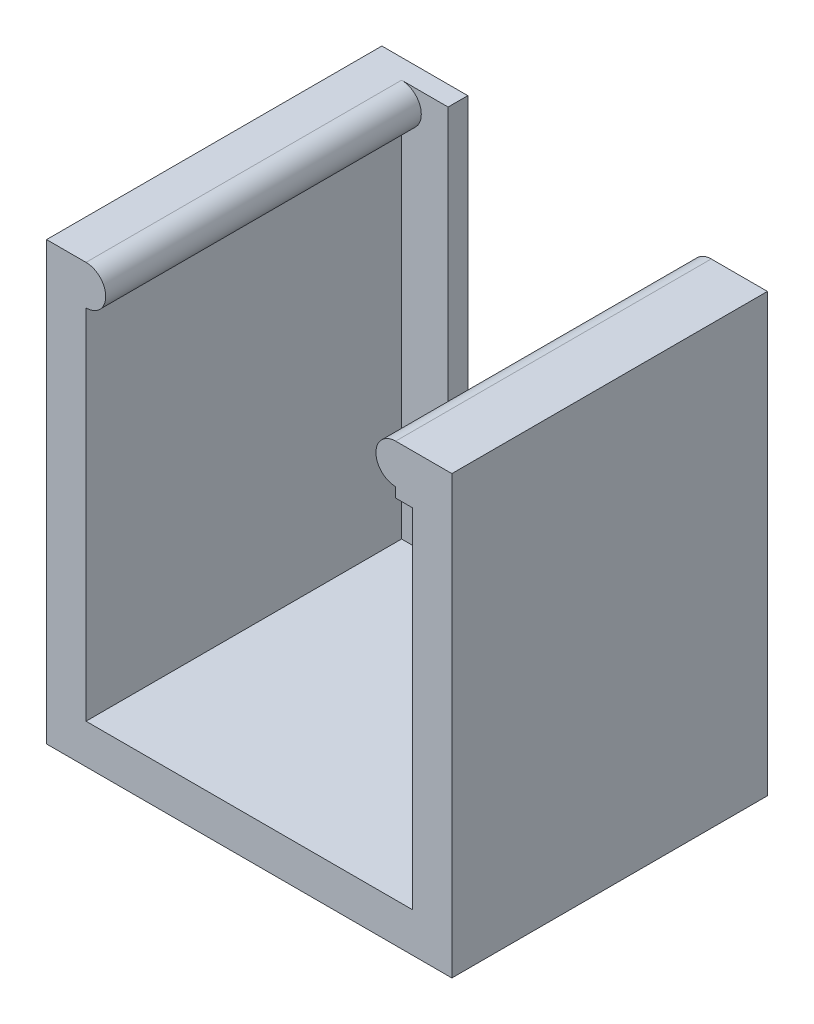
ISO-10303-21;
HEADER;
FILE_DESCRIPTION(('STEP AP214'),'2;1');
FILE_NAME('part.step','',(''),(''),'','','');
FILE_SCHEMA(('AUTOMOTIVE_DESIGN { 1 0 10303 214 1 1 1 1 }'));
ENDSEC;
DATA;
#1=APPLICATION_CONTEXT('core data for automotive mechanical design processes');
#2=APPLICATION_PROTOCOL_DEFINITION('international standard','automotive_design',2000,#1);
#3=PRODUCT_CONTEXT('',#1,'mechanical');
#4=PRODUCT('Part','Part','',(#3));
#5=PRODUCT_RELATED_PRODUCT_CATEGORY('part','',(#4));
#6=PRODUCT_DEFINITION_FORMATION('','',#4);
#7=PRODUCT_DEFINITION_CONTEXT('part definition',#1,'design');
#8=PRODUCT_DEFINITION('design','',#6,#7);
#9=PRODUCT_DEFINITION_SHAPE('','',#8);
#10=(LENGTH_UNIT() NAMED_UNIT(*) SI_UNIT(.MILLI.,.METRE.));
#11=(NAMED_UNIT(*) PLANE_ANGLE_UNIT() SI_UNIT($,.RADIAN.));
#12=(NAMED_UNIT(*) SI_UNIT($,.STERADIAN.) SOLID_ANGLE_UNIT());
#13=UNCERTAINTY_MEASURE_WITH_UNIT(LENGTH_MEASURE(1.E-05),#10,'distance_accuracy_value','');
#14=(GEOMETRIC_REPRESENTATION_CONTEXT(3) GLOBAL_UNCERTAINTY_ASSIGNED_CONTEXT((#13)) GLOBAL_UNIT_ASSIGNED_CONTEXT((#10,
#11,#12)) REPRESENTATION_CONTEXT('',''));
#15=CARTESIAN_POINT('',(0.,0.,0.));
#16=DIRECTION('',(0.,0.,1.));
#17=DIRECTION('',(1.,0.,0.));
#18=AXIS2_PLACEMENT_3D('',#15,#16,#17);
#19=CARTESIAN_POINT('',(7.85,1.,16.));
#20=DIRECTION('',(1.,0.,0.));
#21=DIRECTION('',(0.,0.,-1.));
#22=AXIS2_PLACEMENT_3D('',#19,#20,#21);
#23=PLANE('',#22);
#24=DIRECTION('',(0.,0.,-1.));
#25=VECTOR('',#24,1.);
#26=CARTESIAN_POINT('',(7.85,-0.999999999999997,16.));
#27=LINE('',#26,#25);
#28=CARTESIAN_POINT('',(7.85,-0.999999999999997,0.));
#29=VERTEX_POINT('',#28);
#30=CARTESIAN_POINT('',(7.85,-0.999999999999997,16.));
#31=VERTEX_POINT('',#30);
#32=EDGE_CURVE('E184',#29,#31,#27,.F.);
#33=ORIENTED_EDGE('',*,*,#32,.F.);
#34=DIRECTION('',(0.,-1.,0.));
#35=VECTOR('',#34,1.);
#36=CARTESIAN_POINT('',(7.85,1.,0.));
#37=LINE('',#36,#35);
#38=CARTESIAN_POINT('',(7.85,-1.5,0.));
#39=VERTEX_POINT('',#38);
#40=EDGE_CURVE('E188',#29,#39,#37,.T.);
#41=ORIENTED_EDGE('',*,*,#40,.T.);
#42=DIRECTION('',(0.,0.,-1.));
#43=VECTOR('',#42,1.);
#44=CARTESIAN_POINT('',(7.85,-1.5,16.));
#45=LINE('',#44,#43);
#46=CARTESIAN_POINT('',(7.85,-1.5,16.));
#47=VERTEX_POINT('',#46);
#48=EDGE_CURVE('E253',#47,#39,#45,.T.);
#49=ORIENTED_EDGE('',*,*,#48,.F.);
#50=DIRECTION('',(0.,-1.,0.));
#51=VECTOR('',#50,1.);
#52=CARTESIAN_POINT('',(7.85,1.,16.));
#53=LINE('',#52,#51);
#54=EDGE_CURVE('E189',#31,#47,#53,.T.);
#55=ORIENTED_EDGE('',*,*,#54,.F.);
#56=EDGE_LOOP('',(#33,#41,#49,#55));
#57=FACE_BOUND('',#56,.T.);
#58=ADVANCED_FACE('F35',(#57),#23,.F.);
#59=CARTESIAN_POINT('',(-7.85,0.,16.));
#60=DIRECTION('',(0.,0.,-1.));
#61=DIRECTION('',(-1.,0.,0.));
#62=AXIS2_PLACEMENT_3D('',#59,#60,#61);
#63=CYLINDRICAL_SURFACE('',#62,1.);
#64=DIRECTION('',(0.,0.,-1.));
#65=VECTOR('',#64,1.);
#66=CARTESIAN_POINT('',(-7.85,-1.,16.));
#67=LINE('',#66,#65);
#68=CARTESIAN_POINT('',(-7.85,-1.,0.));
#69=VERTEX_POINT('',#68);
#70=CARTESIAN_POINT('',(-7.85,-1.,16.));
#71=VERTEX_POINT('',#70);
#72=EDGE_CURVE('E256',#69,#71,#67,.F.);
#73=ORIENTED_EDGE('',*,*,#72,.F.);
#74=CARTESIAN_POINT('',(-7.85,0.,0.));
#75=DIRECTION('',(0.,0.,1.));
#76=DIRECTION('',(1.,0.,0.));
#77=AXIS2_PLACEMENT_3D('',#74,#75,#76);
#78=CIRCLE('',#77,1.);
#79=CARTESIAN_POINT('',(-7.85,1.,0.));
#80=VERTEX_POINT('',#79);
#81=EDGE_CURVE('E39',#69,#80,#78,.T.);
#82=ORIENTED_EDGE('',*,*,#81,.T.);
#83=DIRECTION('',(0.,0.,-1.));
#84=VECTOR('',#83,1.);
#85=CARTESIAN_POINT('',(-7.85,1.,16.));
#86=LINE('',#85,#84);
#87=CARTESIAN_POINT('',(-7.85,1.,16.));
#88=VERTEX_POINT('',#87);
#89=EDGE_CURVE('E242',#88,#80,#86,.T.);
#90=ORIENTED_EDGE('',*,*,#89,.F.);
#91=CARTESIAN_POINT('',(-7.85,0.,16.));
#92=DIRECTION('',(0.,0.,1.));
#93=DIRECTION('',(1.,0.,0.));
#94=AXIS2_PLACEMENT_3D('',#91,#92,#93);
#95=CIRCLE('',#94,1.);
#96=EDGE_CURVE('E44',#71,#88,#95,.T.);
#97=ORIENTED_EDGE('',*,*,#96,.F.);
#98=EDGE_LOOP('',(#73,#82,#90,#97));
#99=FACE_BOUND('',#98,.T.);
#100=ADVANCED_FACE('F37',(#99),#63,.T.);
#101=CARTESIAN_POINT('',(-7.85,0.,16.));
#102=DIRECTION('',(0.,0.,1.));
#103=DIRECTION('',(1.,0.,0.));
#104=AXIS2_PLACEMENT_3D('',#101,#102,#103);
#105=PLANE('',#104);
#106=DIRECTION('',(-1.,0.,0.));
#107=VECTOR('',#106,1.);
#108=CARTESIAN_POINT('',(7.85,1.,16.));
#109=LINE('',#108,#107);
#110=CARTESIAN_POINT('',(10.7,1.,16.));
#111=VERTEX_POINT('',#110);
#112=CARTESIAN_POINT('',(7.85,1.,16.));
#113=VERTEX_POINT('',#112);
#114=EDGE_CURVE('E209',#111,#113,#109,.T.);
#115=ORIENTED_EDGE('',*,*,#114,.T.);
#116=CARTESIAN_POINT('',(7.85,0.,16.));
#117=DIRECTION('',(0.,0.,1.));
#118=DIRECTION('',(1.,0.,0.));
#119=AXIS2_PLACEMENT_3D('',#116,#117,#118);
#120=CIRCLE('',#119,1.);
#121=EDGE_CURVE('E177',#113,#31,#120,.T.);
#122=ORIENTED_EDGE('',*,*,#121,.T.);
#123=ORIENTED_EDGE('',*,*,#54,.T.);
#124=DIRECTION('',(1.,0.,0.));
#125=VECTOR('',#124,1.);
#126=CARTESIAN_POINT('',(7.85,-1.5,16.));
#127=LINE('',#126,#125);
#128=CARTESIAN_POINT('',(8.7,-1.5,16.));
#129=VERTEX_POINT('',#128);
#130=EDGE_CURVE('E191',#47,#129,#127,.T.);
#131=ORIENTED_EDGE('',*,*,#130,.T.);
#132=DIRECTION('',(0.,-1.,0.));
#133=VECTOR('',#132,1.);
#134=CARTESIAN_POINT('',(8.7,-1.5,16.));
#135=LINE('',#134,#133);
#136=CARTESIAN_POINT('',(8.7,-19.1487700378055,16.));
#137=VERTEX_POINT('',#136);
#138=EDGE_CURVE('E194',#129,#137,#135,.T.);
#139=ORIENTED_EDGE('',*,*,#138,.T.);
#140=DIRECTION('',(-1.,0.,0.));
#141=VECTOR('',#140,1.);
#142=CARTESIAN_POINT('',(-7.85,-19.1487700378055,16.));
#143=LINE('',#142,#141);
#144=CARTESIAN_POINT('',(-7.85,-19.1487700378055,16.));
#145=VERTEX_POINT('',#144);
#146=EDGE_CURVE('E196',#137,#145,#143,.T.);
#147=ORIENTED_EDGE('',*,*,#146,.T.);
#148=DIRECTION('',(0.,1.,0.));
#149=VECTOR('',#148,1.);
#150=CARTESIAN_POINT('',(-7.85,1.,16.));
#151=LINE('',#150,#149);
#152=EDGE_CURVE('E198',#145,#71,#151,.T.);
#153=ORIENTED_EDGE('',*,*,#152,.T.);
#154=ORIENTED_EDGE('',*,*,#96,.T.);
#155=DIRECTION('',(-1.,0.,0.));
#156=VECTOR('',#155,1.);
#157=CARTESIAN_POINT('',(-7.85,1.,16.));
#158=LINE('',#157,#156);
#159=CARTESIAN_POINT('',(-9.85,1.,16.));
#160=VERTEX_POINT('',#159);
#161=EDGE_CURVE('E201',#88,#160,#158,.T.);
#162=ORIENTED_EDGE('',*,*,#161,.T.);
#163=DIRECTION('',(0.,-1.,0.));
#164=VECTOR('',#163,1.);
#165=CARTESIAN_POINT('',(-9.85,1.,16.));
#166=LINE('',#165,#164);
#167=CARTESIAN_POINT('',(-9.85,-21.1487700378055,16.));
#168=VERTEX_POINT('',#167);
#169=EDGE_CURVE('E203',#160,#168,#166,.T.);
#170=ORIENTED_EDGE('',*,*,#169,.T.);
#171=DIRECTION('',(1.,0.,0.));
#172=VECTOR('',#171,1.);
#173=CARTESIAN_POINT('',(10.7,-21.1487700378055,16.));
#174=LINE('',#173,#172);
#175=CARTESIAN_POINT('',(10.7,-21.1487700378055,16.));
#176=VERTEX_POINT('',#175);
#177=EDGE_CURVE('E205',#168,#176,#174,.T.);
#178=ORIENTED_EDGE('',*,*,#177,.T.);
#179=DIRECTION('',(0.,1.,0.));
#180=VECTOR('',#179,1.);
#181=CARTESIAN_POINT('',(10.7,1.,16.));
#182=LINE('',#181,#180);
#183=EDGE_CURVE('E207',#176,#111,#182,.T.);
#184=ORIENTED_EDGE('',*,*,#183,.T.);
#185=EDGE_LOOP('',(#115,#122,#123,#131,#139,#147,#153,#154,#162,#170,#178,#184));
#186=FACE_BOUND('',#185,.T.);
#187=ADVANCED_FACE('F278',(#186),#105,.T.);
#188=CARTESIAN_POINT('',(-7.85,0.,0.));
#189=DIRECTION('',(0.,0.,1.));
#190=DIRECTION('',(1.,0.,0.));
#191=AXIS2_PLACEMENT_3D('',#188,#189,#190);
#192=PLANE('',#191);
#193=DIRECTION('',(0.,-1.,0.));
#194=VECTOR('',#193,1.);
#195=CARTESIAN_POINT('',(-9.85,1.,0.));
#196=LINE('',#195,#194);
#197=CARTESIAN_POINT('',(-9.85,-20.3611134108428,0.));
#198=VERTEX_POINT('',#197);
#199=CARTESIAN_POINT('',(-9.85,-21.1487700378055,0.));
#200=VERTEX_POINT('',#199);
#201=EDGE_CURVE('E57',#198,#200,#196,.T.);
#202=ORIENTED_EDGE('',*,*,#201,.F.);
#203=DIRECTION('',(1.,0.,0.));
#204=VECTOR('',#203,1.);
#205=CARTESIAN_POINT('',(-9.85,-20.3611134108428,0.));
#206=LINE('',#205,#204);
#207=CARTESIAN_POINT('',(-5.49189320099877,-20.3611134108428,0.));
#208=VERTEX_POINT('',#207);
#209=EDGE_CURVE('E167',#198,#208,#206,.T.);
#210=ORIENTED_EDGE('',*,*,#209,.T.);
#211=DIRECTION('',(0.,-1.,0.));
#212=VECTOR('',#211,1.);
#213=CARTESIAN_POINT('',(-5.49189320099877,1.,0.));
#214=LINE('',#213,#212);
#215=CARTESIAN_POINT('',(-5.49189320099877,-19.1487700378055,0.));
#216=VERTEX_POINT('',#215);
#217=EDGE_CURVE('E11',#216,#208,#214,.T.);
#218=ORIENTED_EDGE('',*,*,#217,.F.);
#219=DIRECTION('',(-1.,0.,0.));
#220=VECTOR('',#219,1.);
#221=CARTESIAN_POINT('',(-7.85,-19.1487700378055,0.));
#222=LINE('',#221,#220);
#223=CARTESIAN_POINT('',(8.7,-19.1487700378055,0.));
#224=VERTEX_POINT('',#223);
#225=EDGE_CURVE('E218',#224,#216,#222,.T.);
#226=ORIENTED_EDGE('',*,*,#225,.F.);
#227=DIRECTION('',(0.,-1.,0.));
#228=VECTOR('',#227,1.);
#229=CARTESIAN_POINT('',(8.7,-1.5,0.));
#230=LINE('',#229,#228);
#231=CARTESIAN_POINT('',(8.7,-1.5,0.));
#232=VERTEX_POINT('',#231);
#233=EDGE_CURVE('E215',#232,#224,#230,.T.);
#234=ORIENTED_EDGE('',*,*,#233,.F.);
#235=DIRECTION('',(1.,0.,0.));
#236=VECTOR('',#235,1.);
#237=CARTESIAN_POINT('',(7.85,-1.5,0.));
#238=LINE('',#237,#236);
#239=EDGE_CURVE('E213',#39,#232,#238,.T.);
#240=ORIENTED_EDGE('',*,*,#239,.F.);
#241=ORIENTED_EDGE('',*,*,#40,.F.);
#242=CARTESIAN_POINT('',(7.85,0.,0.));
#243=DIRECTION('',(0.,0.,1.));
#244=DIRECTION('',(1.,0.,0.));
#245=AXIS2_PLACEMENT_3D('',#242,#243,#244);
#246=CIRCLE('',#245,1.);
#247=CARTESIAN_POINT('',(7.85,1.,0.));
#248=VERTEX_POINT('',#247);
#249=EDGE_CURVE('E174',#248,#29,#246,.T.);
#250=ORIENTED_EDGE('',*,*,#249,.F.);
#251=DIRECTION('',(-1.,0.,0.));
#252=VECTOR('',#251,1.);
#253=CARTESIAN_POINT('',(7.85,1.,0.));
#254=LINE('',#253,#252);
#255=CARTESIAN_POINT('',(10.7,1.,0.));
#256=VERTEX_POINT('',#255);
#257=EDGE_CURVE('E192',#256,#248,#254,.T.);
#258=ORIENTED_EDGE('',*,*,#257,.F.);
#259=DIRECTION('',(0.,1.,0.));
#260=VECTOR('',#259,1.);
#261=CARTESIAN_POINT('',(10.7,1.,0.));
#262=LINE('',#261,#260);
#263=CARTESIAN_POINT('',(10.7,-21.1487700378055,0.));
#264=VERTEX_POINT('',#263);
#265=EDGE_CURVE('E226',#264,#256,#262,.T.);
#266=ORIENTED_EDGE('',*,*,#265,.F.);
#267=DIRECTION('',(1.,0.,0.));
#268=VECTOR('',#267,1.);
#269=CARTESIAN_POINT('',(10.7,-21.1487700378055,0.));
#270=LINE('',#269,#268);
#271=EDGE_CURVE('E224',#200,#264,#270,.T.);
#272=ORIENTED_EDGE('',*,*,#271,.F.);
#273=EDGE_LOOP('',(#202,#210,#218,#226,#234,#240,#241,#250,#258,#266,#272));
#274=FACE_BOUND('',#273,.T.);
#275=ADVANCED_FACE('F275',(#274),#192,.F.);
#276=CARTESIAN_POINT('',(-7.85,1.,16.));
#277=DIRECTION('',(-1.,0.,0.));
#278=DIRECTION('',(0.,-1.,0.));
#279=AXIS2_PLACEMENT_3D('',#276,#277,#278);
#280=PLANE('',#279);
#281=DIRECTION('',(0.,1.,0.));
#282=VECTOR('',#281,1.);
#283=CARTESIAN_POINT('',(-7.85,1.,0.));
#284=LINE('',#283,#282);
#285=CARTESIAN_POINT('',(-7.85,-19.1487700378055,0.));
#286=VERTEX_POINT('',#285);
#287=EDGE_CURVE('E220',#286,#69,#284,.T.);
#288=ORIENTED_EDGE('',*,*,#287,.T.);
#289=ORIENTED_EDGE('',*,*,#72,.T.);
#290=ORIENTED_EDGE('',*,*,#152,.F.);
#291=DIRECTION('',(0.,0.,-1.));
#292=VECTOR('',#291,1.);
#293=CARTESIAN_POINT('',(-7.85,-19.1487700378055,16.));
#294=LINE('',#293,#292);
#295=EDGE_CURVE('E244',#145,#286,#294,.T.);
#296=ORIENTED_EDGE('',*,*,#295,.T.);
#297=EDGE_LOOP('',(#288,#289,#290,#296));
#298=FACE_BOUND('',#297,.T.);
#299=ADVANCED_FACE('F277',(#298),#280,.F.);
#300=CARTESIAN_POINT('',(7.85,-1.5,16.));
#301=DIRECTION('',(0.,1.,0.));
#302=DIRECTION('',(0.,0.,1.));
#303=AXIS2_PLACEMENT_3D('',#300,#301,#302);
#304=PLANE('',#303);
#305=ORIENTED_EDGE('',*,*,#239,.T.);
#306=DIRECTION('',(0.,0.,-1.));
#307=VECTOR('',#306,1.);
#308=CARTESIAN_POINT('',(8.7,-1.5,16.));
#309=LINE('',#308,#307);
#310=EDGE_CURVE('E250',#129,#232,#309,.T.);
#311=ORIENTED_EDGE('',*,*,#310,.F.);
#312=ORIENTED_EDGE('',*,*,#130,.F.);
#313=ORIENTED_EDGE('',*,*,#48,.T.);
#314=EDGE_LOOP('',(#305,#311,#312,#313));
#315=FACE_BOUND('',#314,.T.);
#316=ADVANCED_FACE('F283',(#315),#304,.F.);
#317=CARTESIAN_POINT('',(8.7,-1.5,16.));
#318=DIRECTION('',(1.,0.,0.));
#319=DIRECTION('',(0.,1.,0.));
#320=AXIS2_PLACEMENT_3D('',#317,#318,#319);
#321=PLANE('',#320);
#322=ORIENTED_EDGE('',*,*,#233,.T.);
#323=DIRECTION('',(0.,0.,-1.));
#324=VECTOR('',#323,1.);
#325=CARTESIAN_POINT('',(8.7,-19.1487700378055,16.));
#326=LINE('',#325,#324);
#327=EDGE_CURVE('E247',#137,#224,#326,.T.);
#328=ORIENTED_EDGE('',*,*,#327,.F.);
#329=ORIENTED_EDGE('',*,*,#138,.F.);
#330=ORIENTED_EDGE('',*,*,#310,.T.);
#331=EDGE_LOOP('',(#322,#328,#329,#330));
#332=FACE_BOUND('',#331,.T.);
#333=ADVANCED_FACE('F297',(#332),#321,.F.);
#334=CARTESIAN_POINT('',(-7.85,-19.1487700378055,16.));
#335=DIRECTION('',(0.,-1.,0.));
#336=DIRECTION('',(0.,0.,-1.));
#337=AXIS2_PLACEMENT_3D('',#334,#335,#336);
#338=PLANE('',#337);
#339=ORIENTED_EDGE('',*,*,#225,.T.);
#340=EDGE_CURVE('E217',#216,#286,#222,.T.);
#341=ORIENTED_EDGE('',*,*,#340,.T.);
#342=ORIENTED_EDGE('',*,*,#295,.F.);
#343=ORIENTED_EDGE('',*,*,#146,.F.);
#344=ORIENTED_EDGE('',*,*,#327,.T.);
#345=EDGE_LOOP('',(#339,#341,#342,#343,#344));
#346=FACE_BOUND('',#345,.T.);
#347=ADVANCED_FACE('F301',(#346),#338,.F.);
#348=CARTESIAN_POINT('',(-7.85,1.,16.));
#349=DIRECTION('',(0.,-1.,0.));
#350=DIRECTION('',(1.,0.,0.));
#351=AXIS2_PLACEMENT_3D('',#348,#349,#350);
#352=PLANE('',#351);
#353=ORIENTED_EDGE('',*,*,#89,.T.);
#354=DIRECTION('',(1.,0.,0.));
#355=VECTOR('',#354,1.);
#356=CARTESIAN_POINT('',(-9.85,1.,0.));
#357=LINE('',#356,#355);
#358=CARTESIAN_POINT('',(-5.49189320099877,1.,0.));
#359=VERTEX_POINT('',#358);
#360=EDGE_CURVE('E172',#80,#359,#357,.T.);
#361=ORIENTED_EDGE('',*,*,#360,.T.);
#362=DIRECTION('',(0.,0.,1.));
#363=VECTOR('',#362,1.);
#364=CARTESIAN_POINT('',(-5.49189320099877,1.,-1.));
#365=LINE('',#364,#363);
#366=CARTESIAN_POINT('',(-5.49189320099877,1.,-1.));
#367=VERTEX_POINT('',#366);
#368=EDGE_CURVE('E151',#367,#359,#365,.T.);
#369=ORIENTED_EDGE('',*,*,#368,.F.);
#370=DIRECTION('',(1.,0.,0.));
#371=VECTOR('',#370,1.);
#372=CARTESIAN_POINT('',(-9.85,1.,-1.));
#373=LINE('',#372,#371);
#374=CARTESIAN_POINT('',(-9.85,1.,-1.));
#375=VERTEX_POINT('',#374);
#376=EDGE_CURVE('E158',#375,#367,#373,.T.);
#377=ORIENTED_EDGE('',*,*,#376,.F.);
#378=DIRECTION('',(0.,0.,-1.));
#379=VECTOR('',#378,1.);
#380=CARTESIAN_POINT('',(-9.85,1.,16.));
#381=LINE('',#380,#379);
#382=EDGE_CURVE('E240',#160,#375,#381,.T.);
#383=ORIENTED_EDGE('',*,*,#382,.F.);
#384=ORIENTED_EDGE('',*,*,#161,.F.);
#385=EDGE_LOOP('',(#353,#361,#369,#377,#383,#384));
#386=FACE_BOUND('',#385,.T.);
#387=ADVANCED_FACE('F170',(#386),#352,.F.);
#388=CARTESIAN_POINT('',(-9.85,1.,16.));
#389=DIRECTION('',(1.,0.,0.));
#390=DIRECTION('',(0.,1.,0.));
#391=AXIS2_PLACEMENT_3D('',#388,#389,#390);
#392=PLANE('',#391);
#393=ORIENTED_EDGE('',*,*,#382,.T.);
#394=DIRECTION('',(0.,-1.,0.));
#395=VECTOR('',#394,1.);
#396=CARTESIAN_POINT('',(-9.85,1.,-1.));
#397=LINE('',#396,#395);
#398=CARTESIAN_POINT('',(-9.85,-20.3611134108428,-1.));
#399=VERTEX_POINT('',#398);
#400=EDGE_CURVE('E164',#375,#399,#397,.T.);
#401=ORIENTED_EDGE('',*,*,#400,.T.);
#402=DIRECTION('',(0.,0.,1.));
#403=VECTOR('',#402,1.);
#404=CARTESIAN_POINT('',(-9.85,-20.3611134108428,-1.));
#405=LINE('',#404,#403);
#406=EDGE_CURVE('E179',#399,#198,#405,.T.);
#407=ORIENTED_EDGE('',*,*,#406,.T.);
#408=ORIENTED_EDGE('',*,*,#201,.T.);
#409=DIRECTION('',(0.,0.,-1.));
#410=VECTOR('',#409,1.);
#411=CARTESIAN_POINT('',(-9.85,-21.1487700378055,16.));
#412=LINE('',#411,#410);
#413=EDGE_CURVE('E237',#168,#200,#412,.T.);
#414=ORIENTED_EDGE('',*,*,#413,.F.);
#415=ORIENTED_EDGE('',*,*,#169,.F.);
#416=EDGE_LOOP('',(#393,#401,#407,#408,#414,#415));
#417=FACE_BOUND('',#416,.T.);
#418=ADVANCED_FACE('F308',(#417),#392,.F.);
#419=CARTESIAN_POINT('',(10.7,-21.1487700378055,16.));
#420=DIRECTION('',(0.,1.,0.));
#421=DIRECTION('',(0.,0.,1.));
#422=AXIS2_PLACEMENT_3D('',#419,#420,#421);
#423=PLANE('',#422);
#424=ORIENTED_EDGE('',*,*,#271,.T.);
#425=DIRECTION('',(0.,0.,-1.));
#426=VECTOR('',#425,1.);
#427=CARTESIAN_POINT('',(10.7,-21.1487700378055,16.));
#428=LINE('',#427,#426);
#429=EDGE_CURVE('E234',#176,#264,#428,.T.);
#430=ORIENTED_EDGE('',*,*,#429,.F.);
#431=ORIENTED_EDGE('',*,*,#177,.F.);
#432=ORIENTED_EDGE('',*,*,#413,.T.);
#433=EDGE_LOOP('',(#424,#430,#431,#432));
#434=FACE_BOUND('',#433,.T.);
#435=ADVANCED_FACE('F311',(#434),#423,.F.);
#436=CARTESIAN_POINT('',(10.7,1.,16.));
#437=DIRECTION('',(-1.,0.,0.));
#438=DIRECTION('',(0.,-1.,0.));
#439=AXIS2_PLACEMENT_3D('',#436,#437,#438);
#440=PLANE('',#439);
#441=ORIENTED_EDGE('',*,*,#265,.T.);
#442=DIRECTION('',(0.,0.,-1.));
#443=VECTOR('',#442,1.);
#444=CARTESIAN_POINT('',(10.7,1.,16.));
#445=LINE('',#444,#443);
#446=EDGE_CURVE('E231',#111,#256,#445,.T.);
#447=ORIENTED_EDGE('',*,*,#446,.F.);
#448=ORIENTED_EDGE('',*,*,#183,.F.);
#449=ORIENTED_EDGE('',*,*,#429,.T.);
#450=EDGE_LOOP('',(#441,#447,#448,#449));
#451=FACE_BOUND('',#450,.T.);
#452=ADVANCED_FACE('F314',(#451),#440,.F.);
#453=CARTESIAN_POINT('',(7.85,1.,16.));
#454=DIRECTION('',(0.,-1.,0.));
#455=DIRECTION('',(0.,0.,-1.));
#456=AXIS2_PLACEMENT_3D('',#453,#454,#455);
#457=PLANE('',#456);
#458=ORIENTED_EDGE('',*,*,#257,.T.);
#459=DIRECTION('',(0.,0.,-1.));
#460=VECTOR('',#459,1.);
#461=CARTESIAN_POINT('',(7.85,1.,16.));
#462=LINE('',#461,#460);
#463=EDGE_CURVE('E211',#113,#248,#462,.T.);
#464=ORIENTED_EDGE('',*,*,#463,.F.);
#465=ORIENTED_EDGE('',*,*,#114,.F.);
#466=ORIENTED_EDGE('',*,*,#446,.T.);
#467=EDGE_LOOP('',(#458,#464,#465,#466));
#468=FACE_BOUND('',#467,.T.);
#469=ADVANCED_FACE('F318',(#468),#457,.F.);
#470=CARTESIAN_POINT('',(7.85,0.,16.));
#471=DIRECTION('',(0.,0.,-1.));
#472=DIRECTION('',(-1.,0.,0.));
#473=AXIS2_PLACEMENT_3D('',#470,#471,#472);
#474=CYLINDRICAL_SURFACE('',#473,1.);
#475=ORIENTED_EDGE('',*,*,#249,.T.);
#476=ORIENTED_EDGE('',*,*,#32,.T.);
#477=ORIENTED_EDGE('',*,*,#121,.F.);
#478=ORIENTED_EDGE('',*,*,#463,.T.);
#479=EDGE_LOOP('',(#475,#476,#477,#478));
#480=FACE_BOUND('',#479,.T.);
#481=ADVANCED_FACE('F322',(#480),#474,.T.);
#482=CARTESIAN_POINT('',(-5.49189320099877,1.,-1.));
#483=DIRECTION('',(-1.,0.,0.));
#484=DIRECTION('',(0.,0.,1.));
#485=AXIS2_PLACEMENT_3D('',#482,#483,#484);
#486=PLANE('',#485);
#487=EDGE_CURVE('E46',#359,#216,#214,.T.);
#488=ORIENTED_EDGE('',*,*,#487,.T.);
#489=ORIENTED_EDGE('',*,*,#217,.T.);
#490=DIRECTION('',(0.,0.,1.));
#491=VECTOR('',#490,1.);
#492=CARTESIAN_POINT('',(-5.49189320099877,-20.3611134108428,-1.));
#493=LINE('',#492,#491);
#494=CARTESIAN_POINT('',(-5.49189320099877,-20.3611134108428,-1.));
#495=VERTEX_POINT('',#494);
#496=EDGE_CURVE('E153',#495,#208,#493,.T.);
#497=ORIENTED_EDGE('',*,*,#496,.F.);
#498=DIRECTION('',(0.,-1.,0.));
#499=VECTOR('',#498,1.);
#500=CARTESIAN_POINT('',(-5.49189320099877,1.,-1.));
#501=LINE('',#500,#499);
#502=EDGE_CURVE('E146',#367,#495,#501,.T.);
#503=ORIENTED_EDGE('',*,*,#502,.F.);
#504=ORIENTED_EDGE('',*,*,#368,.T.);
#505=EDGE_LOOP('',(#488,#489,#497,#503,#504));
#506=FACE_BOUND('',#505,.T.);
#507=ADVANCED_FACE('F149',(#506),#486,.F.);
#508=CARTESIAN_POINT('',(-9.85,-20.3611134108428,-1.));
#509=DIRECTION('',(0.,-1.,0.));
#510=DIRECTION('',(0.,0.,-1.));
#511=AXIS2_PLACEMENT_3D('',#508,#509,#510);
#512=PLANE('',#511);
#513=ORIENTED_EDGE('',*,*,#209,.F.);
#514=ORIENTED_EDGE('',*,*,#406,.F.);
#515=DIRECTION('',(1.,0.,0.));
#516=VECTOR('',#515,1.);
#517=CARTESIAN_POINT('',(-9.85,-20.3611134108428,-1.));
#518=LINE('',#517,#516);
#519=EDGE_CURVE('E157',#399,#495,#518,.T.);
#520=ORIENTED_EDGE('',*,*,#519,.T.);
#521=ORIENTED_EDGE('',*,*,#496,.T.);
#522=EDGE_LOOP('',(#513,#514,#520,#521));
#523=FACE_BOUND('',#522,.T.);
#524=ADVANCED_FACE('F274',(#523),#512,.T.);
#525=CARTESIAN_POINT('',(0.,0.,-1.));
#526=DIRECTION('',(0.,0.,-1.));
#527=DIRECTION('',(-1.,0.,0.));
#528=AXIS2_PLACEMENT_3D('',#525,#526,#527);
#529=PLANE('',#528);
#530=ORIENTED_EDGE('',*,*,#376,.T.);
#531=ORIENTED_EDGE('',*,*,#502,.T.);
#532=ORIENTED_EDGE('',*,*,#519,.F.);
#533=ORIENTED_EDGE('',*,*,#400,.F.);
#534=EDGE_LOOP('',(#530,#531,#532,#533));
#535=FACE_BOUND('',#534,.T.);
#536=ADVANCED_FACE('F162',(#535),#529,.T.);
#537=CARTESIAN_POINT('',(0.,0.,0.));
#538=DIRECTION('',(0.,0.,-1.));
#539=DIRECTION('',(-1.,0.,0.));
#540=AXIS2_PLACEMENT_3D('',#537,#538,#539);
#541=PLANE('',#540);
#542=ORIENTED_EDGE('',*,*,#81,.F.);
#543=ORIENTED_EDGE('',*,*,#287,.F.);
#544=ORIENTED_EDGE('',*,*,#340,.F.);
#545=ORIENTED_EDGE('',*,*,#487,.F.);
#546=ORIENTED_EDGE('',*,*,#360,.F.);
#547=EDGE_LOOP('',(#542,#543,#544,#545,#546));
#548=FACE_BOUND('',#547,.T.);
#549=ADVANCED_FACE('F265',(#548),#541,.F.);
#550=CLOSED_SHELL('',(#58,#100,#187,#275,#299,#316,#333,#347,#387,#418,#435,#452,#469,#481,#507,
#524,#536,#549));
#551=MANIFOLD_SOLID_BREP('B2',#550);
#552=ADVANCED_BREP_SHAPE_REPRESENTATION('',(#18,#551),#14);
#553=SHAPE_DEFINITION_REPRESENTATION(#9,#552);
ENDSEC;
END-ISO-10303-21;
